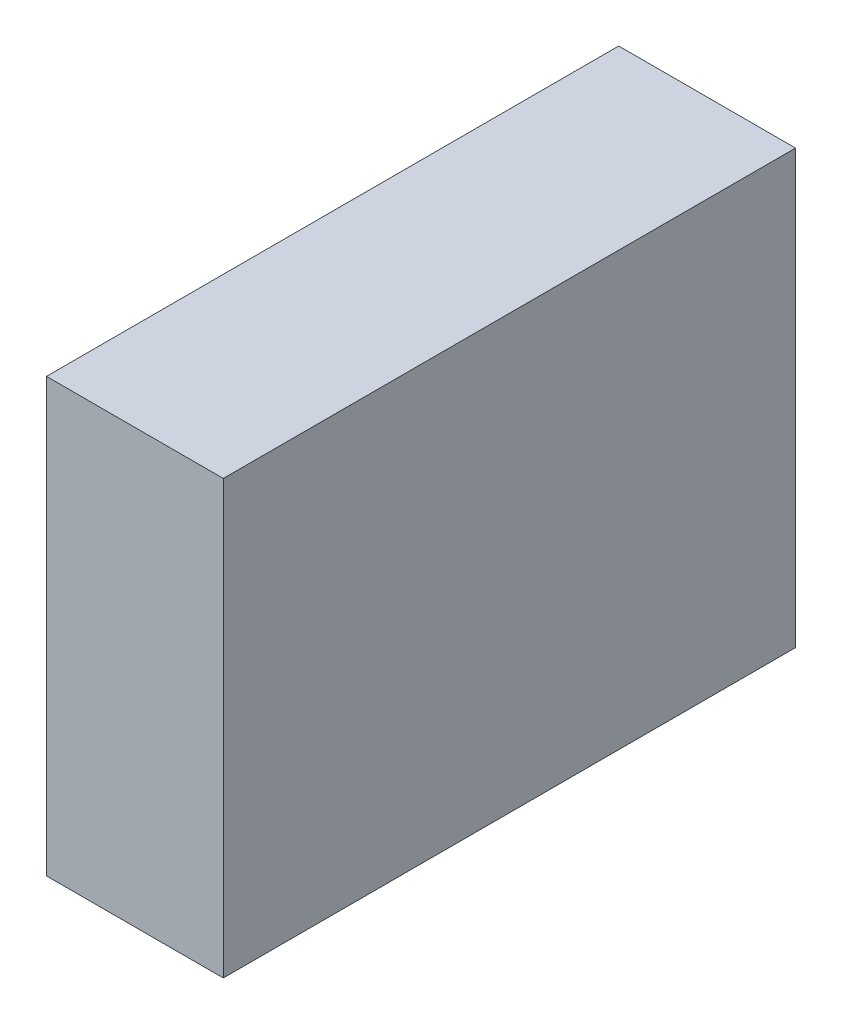
ISO-10303-21;
HEADER;
FILE_DESCRIPTION(('STEP AP214'),'2;1');
FILE_NAME('part.step','',(''),(''),'','','');
FILE_SCHEMA(('AUTOMOTIVE_DESIGN { 1 0 10303 214 1 1 1 1 }'));
ENDSEC;
DATA;
#1=APPLICATION_CONTEXT('core data for automotive mechanical design processes');
#2=APPLICATION_PROTOCOL_DEFINITION('international standard','automotive_design',2000,#1);
#3=PRODUCT_CONTEXT('',#1,'mechanical');
#4=PRODUCT('Part','Part','',(#3));
#5=PRODUCT_RELATED_PRODUCT_CATEGORY('part','',(#4));
#6=PRODUCT_DEFINITION_FORMATION('','',#4);
#7=PRODUCT_DEFINITION_CONTEXT('part definition',#1,'design');
#8=PRODUCT_DEFINITION('design','',#6,#7);
#9=PRODUCT_DEFINITION_SHAPE('','',#8);
#10=(LENGTH_UNIT() NAMED_UNIT(*) SI_UNIT(.MILLI.,.METRE.));
#11=(NAMED_UNIT(*) PLANE_ANGLE_UNIT() SI_UNIT($,.RADIAN.));
#12=(NAMED_UNIT(*) SI_UNIT($,.STERADIAN.) SOLID_ANGLE_UNIT());
#13=UNCERTAINTY_MEASURE_WITH_UNIT(LENGTH_MEASURE(1.E-05),#10,'distance_accuracy_value','');
#14=(GEOMETRIC_REPRESENTATION_CONTEXT(3) GLOBAL_UNCERTAINTY_ASSIGNED_CONTEXT((#13)) GLOBAL_UNIT_ASSIGNED_CONTEXT((#10,
#11,#12)) REPRESENTATION_CONTEXT('',''));
#15=CARTESIAN_POINT('',(0.,0.,0.));
#16=DIRECTION('',(0.,0.,1.));
#17=DIRECTION('',(1.,0.,0.));
#18=AXIS2_PLACEMENT_3D('',#15,#16,#17);
#19=CARTESIAN_POINT('',(0.,1500.,0.));
#20=DIRECTION('',(1.,0.,0.));
#21=DIRECTION('',(0.,0.,-1.));
#22=AXIS2_PLACEMENT_3D('',#19,#20,#21);
#23=PLANE('',#22);
#24=DIRECTION('',(0.,0.,1.));
#25=VECTOR('',#24,1.);
#26=CARTESIAN_POINT('',(0.,0.,0.));
#27=LINE('',#26,#25);
#28=CARTESIAN_POINT('',(-3.60822483003176E-13,0.,-1984.));
#29=VERTEX_POINT('',#28);
#30=CARTESIAN_POINT('',(0.,0.,0.));
#31=VERTEX_POINT('',#30);
#32=EDGE_CURVE('E111',#29,#31,#27,.T.);
#33=ORIENTED_EDGE('',*,*,#32,.T.);
#34=DIRECTION('',(0.,-1.,0.));
#35=VECTOR('',#34,1.);
#36=CARTESIAN_POINT('',(0.,1500.,0.));
#37=LINE('',#36,#35);
#38=CARTESIAN_POINT('',(0.,1500.,0.));
#39=VERTEX_POINT('',#38);
#40=EDGE_CURVE('E11',#39,#31,#37,.T.);
#41=ORIENTED_EDGE('',*,*,#40,.F.);
#42=DIRECTION('',(0.,0.,1.));
#43=VECTOR('',#42,1.);
#44=CARTESIAN_POINT('',(0.,1500.,0.));
#45=LINE('',#44,#43);
#46=CARTESIAN_POINT('',(-3.60822483003176E-13,1500.,-1984.));
#47=VERTEX_POINT('',#46);
#48=EDGE_CURVE('E95',#47,#39,#45,.T.);
#49=ORIENTED_EDGE('',*,*,#48,.F.);
#50=DIRECTION('',(0.,-1.,0.));
#51=VECTOR('',#50,1.);
#52=CARTESIAN_POINT('',(-3.60822483003176E-13,1500.,-1984.));
#53=LINE('',#52,#51);
#54=EDGE_CURVE('E107',#47,#29,#53,.T.);
#55=ORIENTED_EDGE('',*,*,#54,.T.);
#56=EDGE_LOOP('',(#33,#41,#49,#55));
#57=FACE_BOUND('',#56,.T.);
#58=ADVANCED_FACE('F43',(#57),#23,.F.);
#59=CARTESIAN_POINT('',(0.,1500.,0.));
#60=DIRECTION('',(0.,0.,-1.));
#61=DIRECTION('',(-1.,0.,0.));
#62=AXIS2_PLACEMENT_3D('',#59,#60,#61);
#63=PLANE('',#62);
#64=DIRECTION('',(1.,0.,0.));
#65=VECTOR('',#64,1.);
#66=CARTESIAN_POINT('',(0.,0.,0.));
#67=LINE('',#66,#65);
#68=CARTESIAN_POINT('',(613.,0.,0.));
#69=VERTEX_POINT('',#68);
#70=EDGE_CURVE('E100',#31,#69,#67,.T.);
#71=ORIENTED_EDGE('',*,*,#70,.T.);
#72=DIRECTION('',(0.,-1.,0.));
#73=VECTOR('',#72,1.);
#74=CARTESIAN_POINT('',(613.,1500.,0.));
#75=LINE('',#74,#73);
#76=CARTESIAN_POINT('',(613.,1500.,0.));
#77=VERTEX_POINT('',#76);
#78=EDGE_CURVE('E52',#77,#69,#75,.T.);
#79=ORIENTED_EDGE('',*,*,#78,.F.);
#80=DIRECTION('',(1.,0.,0.));
#81=VECTOR('',#80,1.);
#82=CARTESIAN_POINT('',(0.,1500.,0.));
#83=LINE('',#82,#81);
#84=EDGE_CURVE('E90',#39,#77,#83,.T.);
#85=ORIENTED_EDGE('',*,*,#84,.F.);
#86=ORIENTED_EDGE('',*,*,#40,.T.);
#87=EDGE_LOOP('',(#71,#79,#85,#86));
#88=FACE_BOUND('',#87,.T.);
#89=ADVANCED_FACE('F99',(#88),#63,.F.);
#90=CARTESIAN_POINT('',(613.,1500.,0.));
#91=DIRECTION('',(-1.,0.,0.));
#92=DIRECTION('',(0.,0.,1.));
#93=AXIS2_PLACEMENT_3D('',#90,#91,#92);
#94=PLANE('',#93);
#95=DIRECTION('',(0.,0.,-1.));
#96=VECTOR('',#95,1.);
#97=CARTESIAN_POINT('',(613.,0.,0.));
#98=LINE('',#97,#96);
#99=CARTESIAN_POINT('',(613.,0.,-1984.));
#100=VERTEX_POINT('',#99);
#101=EDGE_CURVE('E77',#69,#100,#98,.T.);
#102=ORIENTED_EDGE('',*,*,#101,.T.);
#103=DIRECTION('',(0.,-1.,0.));
#104=VECTOR('',#103,1.);
#105=CARTESIAN_POINT('',(613.,1500.,-1984.));
#106=LINE('',#105,#104);
#107=CARTESIAN_POINT('',(613.,1500.,-1984.));
#108=VERTEX_POINT('',#107);
#109=EDGE_CURVE('E102',#108,#100,#106,.T.);
#110=ORIENTED_EDGE('',*,*,#109,.F.);
#111=DIRECTION('',(0.,0.,-1.));
#112=VECTOR('',#111,1.);
#113=CARTESIAN_POINT('',(613.,1500.,0.));
#114=LINE('',#113,#112);
#115=EDGE_CURVE('E93',#77,#108,#114,.T.);
#116=ORIENTED_EDGE('',*,*,#115,.F.);
#117=ORIENTED_EDGE('',*,*,#78,.T.);
#118=EDGE_LOOP('',(#102,#110,#116,#117));
#119=FACE_BOUND('',#118,.T.);
#120=ADVANCED_FACE('F103',(#119),#94,.F.);
#121=CARTESIAN_POINT('',(-3.60822483003176E-13,1500.,-1984.));
#122=DIRECTION('',(0.,0.,1.));
#123=DIRECTION('',(1.,0.,0.));
#124=AXIS2_PLACEMENT_3D('',#121,#122,#123);
#125=PLANE('',#124);
#126=DIRECTION('',(-1.,0.,0.));
#127=VECTOR('',#126,1.);
#128=CARTESIAN_POINT('',(-3.60822483003176E-13,0.,-1984.));
#129=LINE('',#128,#127);
#130=EDGE_CURVE('E83',#100,#29,#129,.T.);
#131=ORIENTED_EDGE('',*,*,#130,.T.);
#132=ORIENTED_EDGE('',*,*,#54,.F.);
#133=DIRECTION('',(-1.,0.,0.));
#134=VECTOR('',#133,1.);
#135=CARTESIAN_POINT('',(-3.60822483003176E-13,1500.,-1984.));
#136=LINE('',#135,#134);
#137=EDGE_CURVE('E60',#108,#47,#136,.T.);
#138=ORIENTED_EDGE('',*,*,#137,.F.);
#139=ORIENTED_EDGE('',*,*,#109,.T.);
#140=EDGE_LOOP('',(#131,#132,#138,#139));
#141=FACE_BOUND('',#140,.T.);
#142=ADVANCED_FACE('F124',(#141),#125,.F.);
#143=CARTESIAN_POINT('',(0.,1500.,0.));
#144=DIRECTION('',(0.,-1.,0.));
#145=DIRECTION('',(0.,0.,-1.));
#146=AXIS2_PLACEMENT_3D('',#143,#144,#145);
#147=PLANE('',#146);
#148=ORIENTED_EDGE('',*,*,#48,.T.);
#149=ORIENTED_EDGE('',*,*,#84,.T.);
#150=ORIENTED_EDGE('',*,*,#115,.T.);
#151=ORIENTED_EDGE('',*,*,#137,.T.);
#152=EDGE_LOOP('',(#148,#149,#150,#151));
#153=FACE_BOUND('',#152,.T.);
#154=ADVANCED_FACE('F91',(#153),#147,.F.);
#155=CARTESIAN_POINT('',(0.,0.,0.));
#156=DIRECTION('',(0.,-1.,0.));
#157=DIRECTION('',(0.,0.,-1.));
#158=AXIS2_PLACEMENT_3D('',#155,#156,#157);
#159=PLANE('',#158);
#160=ORIENTED_EDGE('',*,*,#32,.F.);
#161=ORIENTED_EDGE('',*,*,#130,.F.);
#162=ORIENTED_EDGE('',*,*,#101,.F.);
#163=ORIENTED_EDGE('',*,*,#70,.F.);
#164=EDGE_LOOP('',(#160,#161,#162,#163));
#165=FACE_BOUND('',#164,.T.);
#166=ADVANCED_FACE('F127',(#165),#159,.T.);
#167=CLOSED_SHELL('',(#58,#89,#120,#142,#154,#166));
#168=MANIFOLD_SOLID_BREP('B2',#167);
#169=ADVANCED_BREP_SHAPE_REPRESENTATION('',(#18,#168),#14);
#170=SHAPE_DEFINITION_REPRESENTATION(#9,#169);
ENDSEC;
END-ISO-10303-21;
